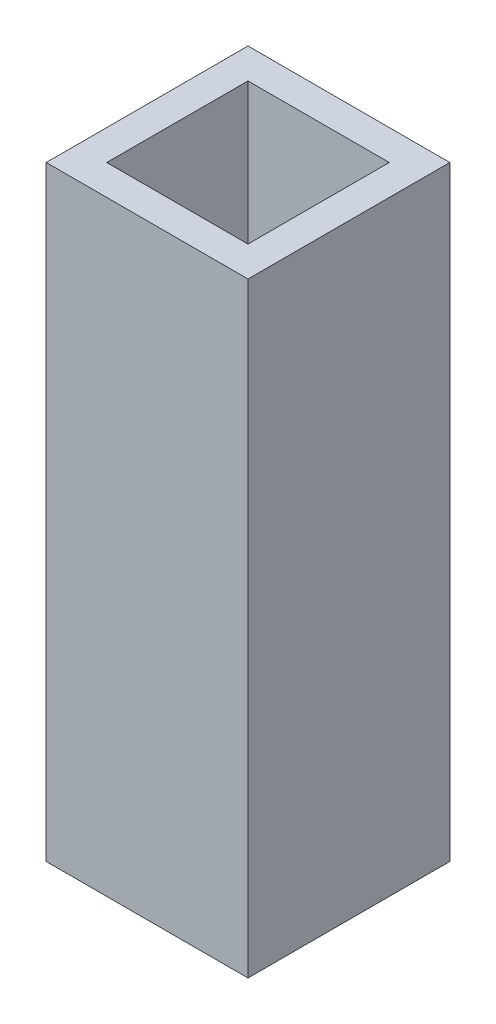
ISO-10303-21;
HEADER;
FILE_DESCRIPTION(('STEP AP214'),'2;1');
FILE_NAME('part.step','',(''),(''),'','','');
FILE_SCHEMA(('AUTOMOTIVE_DESIGN { 1 0 10303 214 1 1 1 1 }'));
ENDSEC;
DATA;
#1=APPLICATION_CONTEXT('core data for automotive mechanical design processes');
#2=APPLICATION_PROTOCOL_DEFINITION('international standard','automotive_design',2000,#1);
#3=PRODUCT_CONTEXT('',#1,'mechanical');
#4=PRODUCT('Part','Part','',(#3));
#5=PRODUCT_RELATED_PRODUCT_CATEGORY('part','',(#4));
#6=PRODUCT_DEFINITION_FORMATION('','',#4);
#7=PRODUCT_DEFINITION_CONTEXT('part definition',#1,'design');
#8=PRODUCT_DEFINITION('design','',#6,#7);
#9=PRODUCT_DEFINITION_SHAPE('','',#8);
#10=(LENGTH_UNIT() NAMED_UNIT(*) SI_UNIT(.MILLI.,.METRE.));
#11=(NAMED_UNIT(*) PLANE_ANGLE_UNIT() SI_UNIT($,.RADIAN.));
#12=(NAMED_UNIT(*) SI_UNIT($,.STERADIAN.) SOLID_ANGLE_UNIT());
#13=UNCERTAINTY_MEASURE_WITH_UNIT(LENGTH_MEASURE(1.E-05),#10,'distance_accuracy_value','');
#14=(GEOMETRIC_REPRESENTATION_CONTEXT(3) GLOBAL_UNCERTAINTY_ASSIGNED_CONTEXT((#13)) GLOBAL_UNIT_ASSIGNED_CONTEXT((#10,
#11,#12)) REPRESENTATION_CONTEXT('',''));
#15=CARTESIAN_POINT('',(0.,0.,0.));
#16=DIRECTION('',(0.,0.,1.));
#17=DIRECTION('',(1.,0.,0.));
#18=AXIS2_PLACEMENT_3D('',#15,#16,#17);
#19=CARTESIAN_POINT('',(0.,38.1,0.));
#20=DIRECTION('',(0.,-1.,0.));
#21=DIRECTION('',(0.,0.,-0.999999999999995));
#22=AXIS2_PLACEMENT_3D('',#19,#20,#21);
#23=PLANE('',#22);
#24=DIRECTION('',(0.,0.,0.999999999999995));
#25=VECTOR('',#24,1.);
#26=CARTESIAN_POINT('',(0.,38.1,0.));
#27=LINE('',#26,#25);
#28=CARTESIAN_POINT('',(0.,38.1,-12.6999999999999));
#29=VERTEX_POINT('',#28);
#30=CARTESIAN_POINT('',(0.,38.1,0.));
#31=VERTEX_POINT('',#30);
#32=EDGE_CURVE('E131',#29,#31,#27,.T.);
#33=ORIENTED_EDGE('',*,*,#32,.T.);
#34=DIRECTION('',(1.,0.,0.));
#35=VECTOR('',#34,1.);
#36=CARTESIAN_POINT('',(0.,38.1,0.));
#37=LINE('',#36,#35);
#38=CARTESIAN_POINT('',(12.7000000000001,38.1000000000001,0.));
#39=VERTEX_POINT('',#38);
#40=EDGE_CURVE('E134',#31,#39,#37,.T.);
#41=ORIENTED_EDGE('',*,*,#40,.T.);
#42=DIRECTION('',(0.,0.,-0.999999999999995));
#43=VECTOR('',#42,1.);
#44=CARTESIAN_POINT('',(12.7000000000001,38.1000000000001,0.));
#45=LINE('',#44,#43);
#46=CARTESIAN_POINT('',(12.7000000000001,38.1000000000001,-12.6999999999999));
#47=VERTEX_POINT('',#46);
#48=EDGE_CURVE('E137',#39,#47,#45,.T.);
#49=ORIENTED_EDGE('',*,*,#48,.T.);
#50=DIRECTION('',(-1.,0.,0.));
#51=VECTOR('',#50,1.);
#52=CARTESIAN_POINT('',(0.,38.1,-12.6999999999999));
#53=LINE('',#52,#51);
#54=EDGE_CURVE('E139',#47,#29,#53,.T.);
#55=ORIENTED_EDGE('',*,*,#54,.T.);
#56=EDGE_LOOP('',(#33,#41,#49,#55));
#57=FACE_BOUND('',#56,.T.);
#58=DIRECTION('',(0.,0.,0.999999999999995));
#59=VECTOR('',#58,1.);
#60=CARTESIAN_POINT('',(1.905,38.1,-10.7949999999999));
#61=LINE('',#60,#59);
#62=CARTESIAN_POINT('',(1.905,38.1,-10.7949999999999));
#63=VERTEX_POINT('',#62);
#64=CARTESIAN_POINT('',(1.905,38.1,-1.905));
#65=VERTEX_POINT('',#64);
#66=EDGE_CURVE('E95',#63,#65,#61,.T.);
#67=ORIENTED_EDGE('',*,*,#66,.F.);
#68=DIRECTION('',(-1.,0.,0.));
#69=VECTOR('',#68,1.);
#70=CARTESIAN_POINT('',(1.905,38.1,-10.7949999999999));
#71=LINE('',#70,#69);
#72=CARTESIAN_POINT('',(10.7950000000001,38.1000000000001,-10.7949999999999));
#73=VERTEX_POINT('',#72);
#74=EDGE_CURVE('E117',#73,#63,#71,.T.);
#75=ORIENTED_EDGE('',*,*,#74,.F.);
#76=DIRECTION('',(0.,0.,-0.999999999999995));
#77=VECTOR('',#76,1.);
#78=CARTESIAN_POINT('',(10.7950000000001,38.1000000000001,-10.7949999999999));
#79=LINE('',#78,#77);
#80=CARTESIAN_POINT('',(10.7950000000001,38.1000000000001,-1.905));
#81=VERTEX_POINT('',#80);
#82=EDGE_CURVE('E115',#81,#73,#79,.T.);
#83=ORIENTED_EDGE('',*,*,#82,.F.);
#84=DIRECTION('',(1.,0.,0.));
#85=VECTOR('',#84,1.);
#86=CARTESIAN_POINT('',(1.905,38.1,-1.905));
#87=LINE('',#86,#85);
#88=EDGE_CURVE('E103',#65,#81,#87,.T.);
#89=ORIENTED_EDGE('',*,*,#88,.F.);
#90=EDGE_LOOP('',(#67,#75,#83,#89));
#91=FACE_BOUND('',#90,.T.);
#92=ADVANCED_FACE('F30',(#57,#91),#23,.F.);
#93=CARTESIAN_POINT('',(0.,0.,0.));
#94=DIRECTION('',(0.,-1.,0.));
#95=DIRECTION('',(0.,0.,-0.999999999999995));
#96=AXIS2_PLACEMENT_3D('',#93,#94,#95);
#97=PLANE('',#96);
#98=DIRECTION('',(0.,0.,0.999999999999995));
#99=VECTOR('',#98,1.);
#100=CARTESIAN_POINT('',(0.,0.,0.));
#101=LINE('',#100,#99);
#102=CARTESIAN_POINT('',(0.,0.,-12.6999999999999));
#103=VERTEX_POINT('',#102);
#104=CARTESIAN_POINT('',(0.,0.,0.));
#105=VERTEX_POINT('',#104);
#106=EDGE_CURVE('E111',#103,#105,#101,.T.);
#107=ORIENTED_EDGE('',*,*,#106,.F.);
#108=DIRECTION('',(-1.,0.,0.));
#109=VECTOR('',#108,1.);
#110=CARTESIAN_POINT('',(0.,0.,-12.6999999999999));
#111=LINE('',#110,#109);
#112=CARTESIAN_POINT('',(12.7,0.,-12.6999999999999));
#113=VERTEX_POINT('',#112);
#114=EDGE_CURVE('E135',#113,#103,#111,.T.);
#115=ORIENTED_EDGE('',*,*,#114,.F.);
#116=DIRECTION('',(0.,0.,-0.999999999999995));
#117=VECTOR('',#116,1.);
#118=CARTESIAN_POINT('',(12.7,0.,0.));
#119=LINE('',#118,#117);
#120=CARTESIAN_POINT('',(12.7,0.,0.));
#121=VERTEX_POINT('',#120);
#122=EDGE_CURVE('E146',#121,#113,#119,.T.);
#123=ORIENTED_EDGE('',*,*,#122,.F.);
#124=DIRECTION('',(1.,0.,0.));
#125=VECTOR('',#124,1.);
#126=CARTESIAN_POINT('',(0.,0.,0.));
#127=LINE('',#126,#125);
#128=EDGE_CURVE('E144',#105,#121,#127,.T.);
#129=ORIENTED_EDGE('',*,*,#128,.F.);
#130=EDGE_LOOP('',(#107,#115,#123,#129));
#131=FACE_BOUND('',#130,.T.);
#132=DIRECTION('',(-1.,0.,0.));
#133=VECTOR('',#132,1.);
#134=CARTESIAN_POINT('',(1.905,0.,-10.7949999999999));
#135=LINE('',#134,#133);
#136=CARTESIAN_POINT('',(10.795,0.,-10.7949999999999));
#137=VERTEX_POINT('',#136);
#138=CARTESIAN_POINT('',(1.905,0.,-10.7949999999999));
#139=VERTEX_POINT('',#138);
#140=EDGE_CURVE('E104',#137,#139,#135,.T.);
#141=ORIENTED_EDGE('',*,*,#140,.T.);
#142=DIRECTION('',(0.,0.,0.999999999999995));
#143=VECTOR('',#142,1.);
#144=CARTESIAN_POINT('',(1.905,0.,-10.7949999999999));
#145=LINE('',#144,#143);
#146=CARTESIAN_POINT('',(1.905,0.,-1.905));
#147=VERTEX_POINT('',#146);
#148=EDGE_CURVE('E53',#139,#147,#145,.T.);
#149=ORIENTED_EDGE('',*,*,#148,.T.);
#150=DIRECTION('',(1.,0.,0.));
#151=VECTOR('',#150,1.);
#152=CARTESIAN_POINT('',(1.905,0.,-1.905));
#153=LINE('',#152,#151);
#154=CARTESIAN_POINT('',(10.795,0.,-1.905));
#155=VERTEX_POINT('',#154);
#156=EDGE_CURVE('E110',#147,#155,#153,.T.);
#157=ORIENTED_EDGE('',*,*,#156,.T.);
#158=DIRECTION('',(0.,0.,-0.999999999999995));
#159=VECTOR('',#158,1.);
#160=CARTESIAN_POINT('',(10.795,0.,-10.7949999999999));
#161=LINE('',#160,#159);
#162=EDGE_CURVE('E123',#155,#137,#161,.T.);
#163=ORIENTED_EDGE('',*,*,#162,.T.);
#164=EDGE_LOOP('',(#141,#149,#157,#163));
#165=FACE_BOUND('',#164,.T.);
#166=ADVANCED_FACE('F164',(#131,#165),#97,.T.);
#167=CARTESIAN_POINT('',(0.,38.1,0.));
#168=DIRECTION('',(1.,0.,0.));
#169=DIRECTION('',(0.,0.,-0.999999999999995));
#170=AXIS2_PLACEMENT_3D('',#167,#168,#169);
#171=PLANE('',#170);
#172=ORIENTED_EDGE('',*,*,#106,.T.);
#173=DIRECTION('',(0.,-1.,0.));
#174=VECTOR('',#173,1.);
#175=CARTESIAN_POINT('',(0.,38.1,0.));
#176=LINE('',#175,#174);
#177=EDGE_CURVE('E11',#31,#105,#176,.T.);
#178=ORIENTED_EDGE('',*,*,#177,.F.);
#179=ORIENTED_EDGE('',*,*,#32,.F.);
#180=DIRECTION('',(0.,-1.,0.));
#181=VECTOR('',#180,1.);
#182=CARTESIAN_POINT('',(0.,38.1,-12.6999999999999));
#183=LINE('',#182,#181);
#184=EDGE_CURVE('E141',#29,#103,#183,.T.);
#185=ORIENTED_EDGE('',*,*,#184,.T.);
#186=EDGE_LOOP('',(#172,#178,#179,#185));
#187=FACE_BOUND('',#186,.T.);
#188=ADVANCED_FACE('F32',(#187),#171,.F.);
#189=CARTESIAN_POINT('',(0.,38.1,0.));
#190=DIRECTION('',(0.,0.,-0.999999999999995));
#191=DIRECTION('',(-1.,0.,0.));
#192=AXIS2_PLACEMENT_3D('',#189,#190,#191);
#193=PLANE('',#192);
#194=ORIENTED_EDGE('',*,*,#128,.T.);
#195=DIRECTION('',(0.,-1.,0.));
#196=VECTOR('',#195,1.);
#197=CARTESIAN_POINT('',(12.7000000000001,38.1000000000001,0.));
#198=LINE('',#197,#196);
#199=EDGE_CURVE('E38',#39,#121,#198,.T.);
#200=ORIENTED_EDGE('',*,*,#199,.F.);
#201=ORIENTED_EDGE('',*,*,#40,.F.);
#202=ORIENTED_EDGE('',*,*,#177,.T.);
#203=EDGE_LOOP('',(#194,#200,#201,#202));
#204=FACE_BOUND('',#203,.T.);
#205=ADVANCED_FACE('F174',(#204),#193,.F.);
#206=CARTESIAN_POINT('',(12.7000000000001,38.1000000000001,0.));
#207=DIRECTION('',(-1.,0.,0.));
#208=DIRECTION('',(0.,0.,0.999999999999995));
#209=AXIS2_PLACEMENT_3D('',#206,#207,#208);
#210=PLANE('',#209);
#211=ORIENTED_EDGE('',*,*,#122,.T.);
#212=DIRECTION('',(0.,-1.,0.));
#213=VECTOR('',#212,1.);
#214=CARTESIAN_POINT('',(12.7000000000001,38.1000000000001,-12.6999999999999));
#215=LINE('',#214,#213);
#216=EDGE_CURVE('E151',#47,#113,#215,.T.);
#217=ORIENTED_EDGE('',*,*,#216,.F.);
#218=ORIENTED_EDGE('',*,*,#48,.F.);
#219=ORIENTED_EDGE('',*,*,#199,.T.);
#220=EDGE_LOOP('',(#211,#217,#218,#219));
#221=FACE_BOUND('',#220,.T.);
#222=ADVANCED_FACE('F158',(#221),#210,.F.);
#223=CARTESIAN_POINT('',(0.,38.1,-12.6999999999999));
#224=DIRECTION('',(0.,0.,0.999999999999995));
#225=DIRECTION('',(1.,0.,0.));
#226=AXIS2_PLACEMENT_3D('',#223,#224,#225);
#227=PLANE('',#226);
#228=ORIENTED_EDGE('',*,*,#114,.T.);
#229=ORIENTED_EDGE('',*,*,#184,.F.);
#230=ORIENTED_EDGE('',*,*,#54,.F.);
#231=ORIENTED_EDGE('',*,*,#216,.T.);
#232=EDGE_LOOP('',(#228,#229,#230,#231));
#233=FACE_BOUND('',#232,.T.);
#234=ADVANCED_FACE('F168',(#233),#227,.F.);
#235=CARTESIAN_POINT('',(1.905,38.1,-10.7949999999999));
#236=DIRECTION('',(1.,0.,0.));
#237=DIRECTION('',(0.,0.,-0.999999999999995));
#238=AXIS2_PLACEMENT_3D('',#235,#236,#237);
#239=PLANE('',#238);
#240=ORIENTED_EDGE('',*,*,#148,.F.);
#241=DIRECTION('',(0.,-1.,0.));
#242=VECTOR('',#241,1.);
#243=CARTESIAN_POINT('',(1.905,38.1,-10.7949999999999));
#244=LINE('',#243,#242);
#245=EDGE_CURVE('E99',#63,#139,#244,.T.);
#246=ORIENTED_EDGE('',*,*,#245,.F.);
#247=ORIENTED_EDGE('',*,*,#66,.T.);
#248=DIRECTION('',(0.,-1.,0.));
#249=VECTOR('',#248,1.);
#250=CARTESIAN_POINT('',(1.905,38.1,-1.905));
#251=LINE('',#250,#249);
#252=EDGE_CURVE('E98',#65,#147,#251,.T.);
#253=ORIENTED_EDGE('',*,*,#252,.T.);
#254=EDGE_LOOP('',(#240,#246,#247,#253));
#255=FACE_BOUND('',#254,.T.);
#256=ADVANCED_FACE('F97',(#255),#239,.T.);
#257=CARTESIAN_POINT('',(1.905,38.1,-1.905));
#258=DIRECTION('',(0.,0.,-0.999999999999995));
#259=DIRECTION('',(-1.,0.,0.));
#260=AXIS2_PLACEMENT_3D('',#257,#258,#259);
#261=PLANE('',#260);
#262=ORIENTED_EDGE('',*,*,#156,.F.);
#263=ORIENTED_EDGE('',*,*,#252,.F.);
#264=ORIENTED_EDGE('',*,*,#88,.T.);
#265=DIRECTION('',(0.,-1.,0.));
#266=VECTOR('',#265,1.);
#267=CARTESIAN_POINT('',(10.7950000000001,38.1000000000001,-1.905));
#268=LINE('',#267,#266);
#269=EDGE_CURVE('E112',#81,#155,#268,.T.);
#270=ORIENTED_EDGE('',*,*,#269,.T.);
#271=EDGE_LOOP('',(#262,#263,#264,#270));
#272=FACE_BOUND('',#271,.T.);
#273=ADVANCED_FACE('F107',(#272),#261,.T.);
#274=CARTESIAN_POINT('',(10.7950000000001,38.1000000000001,-10.7949999999999));
#275=DIRECTION('',(-1.,0.,0.));
#276=DIRECTION('',(0.,0.,0.999999999999995));
#277=AXIS2_PLACEMENT_3D('',#274,#275,#276);
#278=PLANE('',#277);
#279=ORIENTED_EDGE('',*,*,#162,.F.);
#280=ORIENTED_EDGE('',*,*,#269,.F.);
#281=ORIENTED_EDGE('',*,*,#82,.T.);
#282=DIRECTION('',(0.,-1.,0.));
#283=VECTOR('',#282,1.);
#284=CARTESIAN_POINT('',(10.7950000000001,38.1000000000001,-10.7949999999999));
#285=LINE('',#284,#283);
#286=EDGE_CURVE('E45',#73,#137,#285,.T.);
#287=ORIENTED_EDGE('',*,*,#286,.T.);
#288=EDGE_LOOP('',(#279,#280,#281,#287));
#289=FACE_BOUND('',#288,.T.);
#290=ADVANCED_FACE('F197',(#289),#278,.T.);
#291=CARTESIAN_POINT('',(1.905,38.1,-10.7949999999999));
#292=DIRECTION('',(0.,0.,0.999999999999995));
#293=DIRECTION('',(1.,0.,0.));
#294=AXIS2_PLACEMENT_3D('',#291,#292,#293);
#295=PLANE('',#294);
#296=ORIENTED_EDGE('',*,*,#140,.F.);
#297=ORIENTED_EDGE('',*,*,#286,.F.);
#298=ORIENTED_EDGE('',*,*,#74,.T.);
#299=ORIENTED_EDGE('',*,*,#245,.T.);
#300=EDGE_LOOP('',(#296,#297,#298,#299));
#301=FACE_BOUND('',#300,.T.);
#302=ADVANCED_FACE('F201',(#301),#295,.T.);
#303=CLOSED_SHELL('',(#92,#166,#188,#205,#222,#234,#256,#273,#290,#302));
#304=MANIFOLD_SOLID_BREP('B2',#303);
#305=ADVANCED_BREP_SHAPE_REPRESENTATION('',(#18,#304),#14);
#306=SHAPE_DEFINITION_REPRESENTATION(#9,#305);
ENDSEC;
END-ISO-10303-21;
